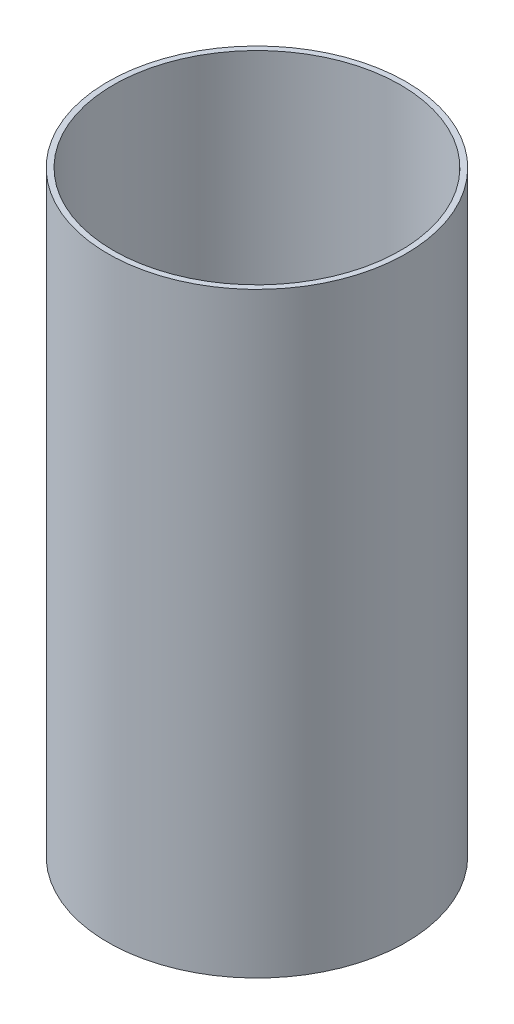
ISO-10303-21;
HEADER;
FILE_DESCRIPTION(('STEP AP214'),'2;1');
FILE_NAME('part.step','',(''),(''),'','','');
FILE_SCHEMA(('AUTOMOTIVE_DESIGN { 1 0 10303 214 1 1 1 1 }'));
ENDSEC;
DATA;
#1=APPLICATION_CONTEXT('core data for automotive mechanical design processes');
#2=APPLICATION_PROTOCOL_DEFINITION('international standard','automotive_design',2000,#1);
#3=PRODUCT_CONTEXT('',#1,'mechanical');
#4=PRODUCT('Part','Part','',(#3));
#5=PRODUCT_RELATED_PRODUCT_CATEGORY('part','',(#4));
#6=PRODUCT_DEFINITION_FORMATION('','',#4);
#7=PRODUCT_DEFINITION_CONTEXT('part definition',#1,'design');
#8=PRODUCT_DEFINITION('design','',#6,#7);
#9=PRODUCT_DEFINITION_SHAPE('','',#8);
#10=(LENGTH_UNIT() NAMED_UNIT(*) SI_UNIT(.MILLI.,.METRE.));
#11=(NAMED_UNIT(*) PLANE_ANGLE_UNIT() SI_UNIT($,.RADIAN.));
#12=(NAMED_UNIT(*) SI_UNIT($,.STERADIAN.) SOLID_ANGLE_UNIT());
#13=UNCERTAINTY_MEASURE_WITH_UNIT(LENGTH_MEASURE(1.E-05),#10,'distance_accuracy_value','');
#14=(GEOMETRIC_REPRESENTATION_CONTEXT(3) GLOBAL_UNCERTAINTY_ASSIGNED_CONTEXT((#13)) GLOBAL_UNIT_ASSIGNED_CONTEXT((#10,
#11,#12)) REPRESENTATION_CONTEXT('',''));
#15=CARTESIAN_POINT('',(0.,0.,0.));
#16=DIRECTION('',(0.,0.,1.));
#17=DIRECTION('',(1.,0.,0.));
#18=AXIS2_PLACEMENT_3D('',#15,#16,#17);
#19=CARTESIAN_POINT('',(0.,304.8,0.));
#20=DIRECTION('',(0.,1.,0.));
#21=DIRECTION('',(0.,0.,1.));
#22=AXIS2_PLACEMENT_3D('',#19,#20,#21);
#23=PLANE('',#22);
#24=CARTESIAN_POINT('',(0.,304.8,0.));
#25=DIRECTION('',(0.,1.,0.));
#26=DIRECTION('',(0.,0.,1.));
#27=AXIS2_PLACEMENT_3D('',#24,#25,#26);
#28=CIRCLE('',#27,76.1746);
#29=CARTESIAN_POINT('',(0.,304.8,-76.1746));
#30=VERTEX_POINT('',#29);
#31=EDGE_CURVE('E10',#30,#30,#28,.T.);
#32=ORIENTED_EDGE('',*,*,#31,.T.);
#33=EDGE_LOOP('',(#32));
#34=FACE_BOUND('',#33,.T.);
#35=CARTESIAN_POINT('',(0.,304.8,0.));
#36=DIRECTION('',(0.,1.,0.));
#37=DIRECTION('',(0.,0.,1.));
#38=AXIS2_PLACEMENT_3D('',#35,#36,#37);
#39=CIRCLE('',#38,73.3425);
#40=CARTESIAN_POINT('',(0.,304.8,-73.3425));
#41=VERTEX_POINT('',#40);
#42=EDGE_CURVE('E50',#41,#41,#39,.T.);
#43=ORIENTED_EDGE('',*,*,#42,.F.);
#44=EDGE_LOOP('',(#43));
#45=FACE_BOUND('',#44,.T.);
#46=ADVANCED_FACE('F39',(#34,#45),#23,.T.);
#47=CARTESIAN_POINT('',(0.,0.,0.));
#48=DIRECTION('',(0.,1.,0.));
#49=DIRECTION('',(0.,0.,1.));
#50=AXIS2_PLACEMENT_3D('',#47,#48,#49);
#51=PLANE('',#50);
#52=CARTESIAN_POINT('',(0.,0.,0.));
#53=DIRECTION('',(0.,1.,0.));
#54=DIRECTION('',(0.,0.,1.));
#55=AXIS2_PLACEMENT_3D('',#52,#53,#54);
#56=CIRCLE('',#55,76.1746);
#57=CARTESIAN_POINT('',(0.,0.,-76.1746));
#58=VERTEX_POINT('',#57);
#59=EDGE_CURVE('E43',#58,#58,#56,.T.);
#60=ORIENTED_EDGE('',*,*,#59,.F.);
#61=EDGE_LOOP('',(#60));
#62=FACE_BOUND('',#61,.T.);
#63=CARTESIAN_POINT('',(0.,0.,0.));
#64=DIRECTION('',(0.,1.,0.));
#65=DIRECTION('',(0.,0.,1.));
#66=AXIS2_PLACEMENT_3D('',#63,#64,#65);
#67=CIRCLE('',#66,73.3425);
#68=CARTESIAN_POINT('',(0.,0.,-73.3425));
#69=VERTEX_POINT('',#68);
#70=EDGE_CURVE('E52',#69,#69,#67,.T.);
#71=ORIENTED_EDGE('',*,*,#70,.T.);
#72=EDGE_LOOP('',(#71));
#73=FACE_BOUND('',#72,.T.);
#74=ADVANCED_FACE('F62',(#62,#73),#51,.F.);
#75=CARTESIAN_POINT('',(0.,304.8,0.));
#76=DIRECTION('',(0.,-1.,0.));
#77=DIRECTION('',(0.,0.,-1.));
#78=AXIS2_PLACEMENT_3D('',#75,#76,#77);
#79=CYLINDRICAL_SURFACE('',#78,76.1746);
#80=CARTESIAN_POINT('',(0.,304.8,-76.1746));
#81=CARTESIAN_POINT('',(0.,301.625,-76.1746));
#82=CARTESIAN_POINT('',(0.,298.45,-76.1746));
#83=CARTESIAN_POINT('',(0.,292.1,-76.1746));
#84=CARTESIAN_POINT('',(0.,288.925,-76.1746));
#85=CARTESIAN_POINT('',(0.,282.575,-76.1746));
#86=CARTESIAN_POINT('',(0.,279.4,-76.1746));
#87=CARTESIAN_POINT('',(0.,273.05,-76.1746));
#88=CARTESIAN_POINT('',(0.,269.875,-76.1746));
#89=CARTESIAN_POINT('',(0.,263.525,-76.1746));
#90=CARTESIAN_POINT('',(0.,260.35,-76.1746));
#91=CARTESIAN_POINT('',(0.,254.,-76.1746));
#92=CARTESIAN_POINT('',(0.,250.825,-76.1746));
#93=CARTESIAN_POINT('',(0.,244.475,-76.1746));
#94=CARTESIAN_POINT('',(0.,241.3,-76.1746));
#95=CARTESIAN_POINT('',(0.,234.95,-76.1746));
#96=CARTESIAN_POINT('',(0.,231.775,-76.1746));
#97=CARTESIAN_POINT('',(0.,225.425,-76.1746));
#98=CARTESIAN_POINT('',(0.,222.25,-76.1746));
#99=CARTESIAN_POINT('',(0.,215.9,-76.1746));
#100=CARTESIAN_POINT('',(0.,212.725,-76.1746));
#101=CARTESIAN_POINT('',(0.,206.375,-76.1746));
#102=CARTESIAN_POINT('',(0.,203.2,-76.1746));
#103=CARTESIAN_POINT('',(0.,196.85,-76.1746));
#104=CARTESIAN_POINT('',(0.,193.675,-76.1746));
#105=CARTESIAN_POINT('',(0.,187.325,-76.1746));
#106=CARTESIAN_POINT('',(0.,184.15,-76.1746));
#107=CARTESIAN_POINT('',(0.,177.8,-76.1746));
#108=CARTESIAN_POINT('',(0.,174.625,-76.1746));
#109=CARTESIAN_POINT('',(0.,168.275,-76.1746));
#110=CARTESIAN_POINT('',(0.,165.1,-76.1746));
#111=CARTESIAN_POINT('',(0.,158.75,-76.1746));
#112=CARTESIAN_POINT('',(0.,155.575,-76.1746));
#113=CARTESIAN_POINT('',(0.,149.225,-76.1746));
#114=CARTESIAN_POINT('',(0.,146.05,-76.1746));
#115=CARTESIAN_POINT('',(0.,139.7,-76.1746));
#116=CARTESIAN_POINT('',(0.,136.525,-76.1746));
#117=CARTESIAN_POINT('',(0.,130.175,-76.1746));
#118=CARTESIAN_POINT('',(0.,127.,-76.1746));
#119=CARTESIAN_POINT('',(0.,120.65,-76.1746));
#120=CARTESIAN_POINT('',(0.,117.475,-76.1746));
#121=CARTESIAN_POINT('',(0.,111.125,-76.1746));
#122=CARTESIAN_POINT('',(0.,107.95,-76.1746));
#123=CARTESIAN_POINT('',(0.,101.6,-76.1746));
#124=CARTESIAN_POINT('',(0.,98.425,-76.1746));
#125=CARTESIAN_POINT('',(0.,92.075,-76.1746));
#126=CARTESIAN_POINT('',(0.,88.9,-76.1746));
#127=CARTESIAN_POINT('',(0.,82.55,-76.1746));
#128=CARTESIAN_POINT('',(0.,79.375,-76.1746));
#129=CARTESIAN_POINT('',(0.,73.025,-76.1746));
#130=CARTESIAN_POINT('',(0.,69.85,-76.1746));
#131=CARTESIAN_POINT('',(0.,63.5,-76.1746));
#132=CARTESIAN_POINT('',(0.,60.325,-76.1746));
#133=CARTESIAN_POINT('',(0.,53.975,-76.1746));
#134=CARTESIAN_POINT('',(0.,50.8,-76.1746));
#135=CARTESIAN_POINT('',(0.,44.45,-76.1746));
#136=CARTESIAN_POINT('',(0.,41.275,-76.1746));
#137=CARTESIAN_POINT('',(0.,34.925,-76.1746));
#138=CARTESIAN_POINT('',(0.,31.75,-76.1746));
#139=CARTESIAN_POINT('',(0.,25.4,-76.1746));
#140=CARTESIAN_POINT('',(0.,22.225,-76.1746));
#141=CARTESIAN_POINT('',(0.,15.875,-76.1746));
#142=CARTESIAN_POINT('',(0.,12.7,-76.1746));
#143=CARTESIAN_POINT('',(0.,6.35,-76.1746));
#144=CARTESIAN_POINT('',(0.,3.175,-76.1746));
#145=CARTESIAN_POINT('',(0.,0.,-76.1746));
#146=B_SPLINE_CURVE_WITH_KNOTS('',3,(#80,#81,#82,#83,#84,#85,#86,#87,#88,#89,#90,#91,#92,#93,
#94,#95,#96,#97,#98,#99,#100,#101,#102,#103,#104,#105,#106,#107,#108,#109,#110,#111,#112,#113,
#114,#115,#116,#117,#118,#119,#120,#121,#122,#123,#124,#125,#126,#127,#128,#129,#130,#131,#132,
#133,#134,#135,#136,#137,#138,#139,#140,#141,#142,#143,#144,#145),.UNSPECIFIED.,.F.,.F.,(4,2,2,
2,2,2,2,2,2,2,2,2,2,2,2,2,2,2,2,2,2,2,2,2,2,2,2,2,2,2,2,2,4),(0.,9.52500000000001,19.05,28.575,
38.1,47.625,57.15,66.675,76.2,85.7250000000001,95.2500000000001,104.775,114.3,123.825,133.35,
142.875,152.4,161.925,171.45,180.975,190.5,200.025,209.55,219.075,228.6,238.125,247.65,257.175,
266.7,276.225,285.75,295.275,304.8),.UNSPECIFIED.);
#147=EDGE_CURVE('BSEAM41',#30,#58,#146,.T.);
#148=ORIENTED_EDGE('',*,*,#31,.F.);
#149=ORIENTED_EDGE('',*,*,#59,.T.);
#150=ORIENTED_EDGE('',*,*,#147,.T.);
#151=ORIENTED_EDGE('',*,*,#147,.F.);
#152=EDGE_LOOP('',(#148,#150,#149,#151));
#153=FACE_BOUND('',#152,.T.);
#154=ADVANCED_FACE('F41',(#153),#79,.T.);
#155=CARTESIAN_POINT('',(0.,304.8,0.));
#156=DIRECTION('',(0.,-1.,0.));
#157=DIRECTION('',(0.,0.,-1.));
#158=AXIS2_PLACEMENT_3D('',#155,#156,#157);
#159=CYLINDRICAL_SURFACE('',#158,73.3425);
#160=CARTESIAN_POINT('',(0.,304.8,-73.3425));
#161=CARTESIAN_POINT('',(0.,301.625,-73.3425));
#162=CARTESIAN_POINT('',(0.,298.45,-73.3425));
#163=CARTESIAN_POINT('',(0.,292.1,-73.3425));
#164=CARTESIAN_POINT('',(0.,288.925,-73.3425));
#165=CARTESIAN_POINT('',(0.,282.575,-73.3425));
#166=CARTESIAN_POINT('',(0.,279.4,-73.3425));
#167=CARTESIAN_POINT('',(0.,273.05,-73.3425));
#168=CARTESIAN_POINT('',(0.,269.875,-73.3425));
#169=CARTESIAN_POINT('',(0.,263.525,-73.3425));
#170=CARTESIAN_POINT('',(0.,260.35,-73.3425));
#171=CARTESIAN_POINT('',(0.,254.,-73.3425));
#172=CARTESIAN_POINT('',(0.,250.825,-73.3425));
#173=CARTESIAN_POINT('',(0.,244.475,-73.3425));
#174=CARTESIAN_POINT('',(0.,241.3,-73.3425));
#175=CARTESIAN_POINT('',(0.,234.95,-73.3425));
#176=CARTESIAN_POINT('',(0.,231.775,-73.3425));
#177=CARTESIAN_POINT('',(0.,225.425,-73.3425));
#178=CARTESIAN_POINT('',(0.,222.25,-73.3425));
#179=CARTESIAN_POINT('',(0.,215.9,-73.3425));
#180=CARTESIAN_POINT('',(0.,212.725,-73.3425));
#181=CARTESIAN_POINT('',(0.,206.375,-73.3425));
#182=CARTESIAN_POINT('',(0.,203.2,-73.3425));
#183=CARTESIAN_POINT('',(0.,196.85,-73.3425));
#184=CARTESIAN_POINT('',(0.,193.675,-73.3425));
#185=CARTESIAN_POINT('',(0.,187.325,-73.3425));
#186=CARTESIAN_POINT('',(0.,184.15,-73.3425));
#187=CARTESIAN_POINT('',(0.,177.8,-73.3425));
#188=CARTESIAN_POINT('',(0.,174.625,-73.3425));
#189=CARTESIAN_POINT('',(0.,168.275,-73.3425));
#190=CARTESIAN_POINT('',(0.,165.1,-73.3425));
#191=CARTESIAN_POINT('',(0.,158.75,-73.3425));
#192=CARTESIAN_POINT('',(0.,155.575,-73.3425));
#193=CARTESIAN_POINT('',(0.,149.225,-73.3425));
#194=CARTESIAN_POINT('',(0.,146.05,-73.3425));
#195=CARTESIAN_POINT('',(0.,139.7,-73.3425));
#196=CARTESIAN_POINT('',(0.,136.525,-73.3425));
#197=CARTESIAN_POINT('',(0.,130.175,-73.3425));
#198=CARTESIAN_POINT('',(0.,127.,-73.3425));
#199=CARTESIAN_POINT('',(0.,120.65,-73.3425));
#200=CARTESIAN_POINT('',(0.,117.475,-73.3425));
#201=CARTESIAN_POINT('',(0.,111.125,-73.3425));
#202=CARTESIAN_POINT('',(0.,107.95,-73.3425));
#203=CARTESIAN_POINT('',(0.,101.6,-73.3425));
#204=CARTESIAN_POINT('',(0.,98.425,-73.3425));
#205=CARTESIAN_POINT('',(0.,92.075,-73.3425));
#206=CARTESIAN_POINT('',(0.,88.9,-73.3425));
#207=CARTESIAN_POINT('',(0.,82.55,-73.3425));
#208=CARTESIAN_POINT('',(0.,79.375,-73.3425));
#209=CARTESIAN_POINT('',(0.,73.025,-73.3425));
#210=CARTESIAN_POINT('',(0.,69.85,-73.3425));
#211=CARTESIAN_POINT('',(0.,63.5,-73.3425));
#212=CARTESIAN_POINT('',(0.,60.325,-73.3425));
#213=CARTESIAN_POINT('',(0.,53.975,-73.3425));
#214=CARTESIAN_POINT('',(0.,50.8,-73.3425));
#215=CARTESIAN_POINT('',(0.,44.45,-73.3425));
#216=CARTESIAN_POINT('',(0.,41.275,-73.3425));
#217=CARTESIAN_POINT('',(0.,34.925,-73.3425));
#218=CARTESIAN_POINT('',(0.,31.75,-73.3425));
#219=CARTESIAN_POINT('',(0.,25.4,-73.3425));
#220=CARTESIAN_POINT('',(0.,22.225,-73.3425));
#221=CARTESIAN_POINT('',(0.,15.875,-73.3425));
#222=CARTESIAN_POINT('',(0.,12.7,-73.3425));
#223=CARTESIAN_POINT('',(0.,6.35,-73.3425));
#224=CARTESIAN_POINT('',(0.,3.175,-73.3425));
#225=CARTESIAN_POINT('',(0.,0.,-73.3425));
#226=B_SPLINE_CURVE_WITH_KNOTS('',3,(#160,#161,#162,#163,#164,#165,#166,#167,#168,#169,#170,
#171,#172,#173,#174,#175,#176,#177,#178,#179,#180,#181,#182,#183,#184,#185,#186,#187,#188,#189,
#190,#191,#192,#193,#194,#195,#196,#197,#198,#199,#200,#201,#202,#203,#204,#205,#206,#207,#208,
#209,#210,#211,#212,#213,#214,#215,#216,#217,#218,#219,#220,#221,#222,#223,#224,#225),
.UNSPECIFIED.,.F.,.F.,(4,2,2,2,2,2,2,2,2,2,2,2,2,2,2,2,2,2,2,2,2,2,2,2,2,2,2,2,2,2,2,2,4),(0.,
9.52499999999995,19.05,28.575,38.1,47.625,57.15,66.675,76.2,85.725,95.2499999999999,104.775,
114.3,123.825,133.35,142.875,152.4,161.925,171.45,180.975,190.5,200.025,209.55,219.075,228.6,
238.125,247.65,257.175,266.7,276.225,285.75,295.275,304.8),.UNSPECIFIED.);
#227=EDGE_CURVE('BSEAM58',#41,#69,#226,.T.);
#228=ORIENTED_EDGE('',*,*,#42,.T.);
#229=ORIENTED_EDGE('',*,*,#70,.F.);
#230=ORIENTED_EDGE('',*,*,#227,.T.);
#231=ORIENTED_EDGE('',*,*,#227,.F.);
#232=EDGE_LOOP('',(#228,#230,#229,#231));
#233=FACE_BOUND('',#232,.T.);
#234=ADVANCED_FACE('F58',(#233),#159,.F.);
#235=CLOSED_SHELL('',(#46,#74,#154,#234));
#236=MANIFOLD_SOLID_BREP('B2',#235);
#237=ADVANCED_BREP_SHAPE_REPRESENTATION('',(#18,#236),#14);
#238=SHAPE_DEFINITION_REPRESENTATION(#9,#237);
ENDSEC;
END-ISO-10303-21;
